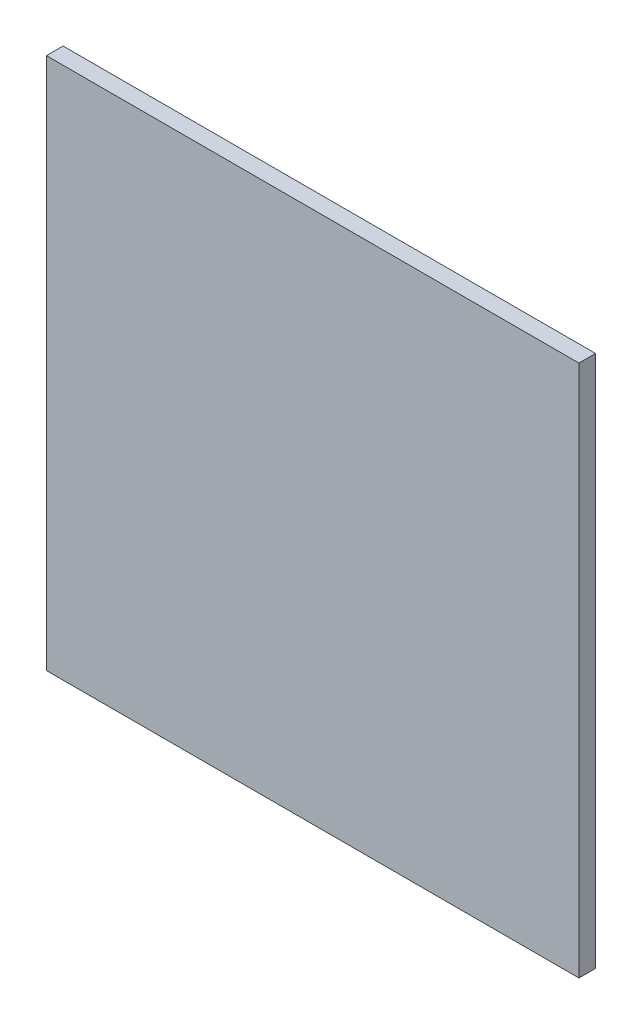
ISO-10303-21;
HEADER;
FILE_DESCRIPTION(('STEP AP214'),'2;1');
FILE_NAME('part.step','',(''),(''),'','','');
FILE_SCHEMA(('AUTOMOTIVE_DESIGN { 1 0 10303 214 1 1 1 1 }'));
ENDSEC;
DATA;
#1=APPLICATION_CONTEXT('core data for automotive mechanical design processes');
#2=APPLICATION_PROTOCOL_DEFINITION('international standard','automotive_design',2000,#1);
#3=PRODUCT_CONTEXT('',#1,'mechanical');
#4=PRODUCT('Part','Part','',(#3));
#5=PRODUCT_RELATED_PRODUCT_CATEGORY('part','',(#4));
#6=PRODUCT_DEFINITION_FORMATION('','',#4);
#7=PRODUCT_DEFINITION_CONTEXT('part definition',#1,'design');
#8=PRODUCT_DEFINITION('design','',#6,#7);
#9=PRODUCT_DEFINITION_SHAPE('','',#8);
#10=(LENGTH_UNIT() NAMED_UNIT(*) SI_UNIT(.MILLI.,.METRE.));
#11=(NAMED_UNIT(*) PLANE_ANGLE_UNIT() SI_UNIT($,.RADIAN.));
#12=(NAMED_UNIT(*) SI_UNIT($,.STERADIAN.) SOLID_ANGLE_UNIT());
#13=UNCERTAINTY_MEASURE_WITH_UNIT(LENGTH_MEASURE(1.E-05),#10,'distance_accuracy_value','');
#14=(GEOMETRIC_REPRESENTATION_CONTEXT(3) GLOBAL_UNCERTAINTY_ASSIGNED_CONTEXT((#13)) GLOBAL_UNIT_ASSIGNED_CONTEXT((#10,
#11,#12)) REPRESENTATION_CONTEXT('',''));
#15=CARTESIAN_POINT('',(0.,0.,0.));
#16=DIRECTION('',(0.,0.,1.));
#17=DIRECTION('',(1.,0.,0.));
#18=AXIS2_PLACEMENT_3D('',#15,#16,#17);
#19=CARTESIAN_POINT('',(0.,0.,19.05));
#20=DIRECTION('',(0.,1.,0.));
#21=DIRECTION('',(0.,0.,1.));
#22=AXIS2_PLACEMENT_3D('',#19,#20,#21);
#23=PLANE('',#22);
#24=DIRECTION('',(1.,0.,0.));
#25=VECTOR('',#24,1.);
#26=CARTESIAN_POINT('',(0.,0.,0.));
#27=LINE('',#26,#25);
#28=CARTESIAN_POINT('',(0.,0.,0.));
#29=VERTEX_POINT('',#28);
#30=CARTESIAN_POINT('',(609.6,0.,0.));
#31=VERTEX_POINT('',#30);
#32=EDGE_CURVE('E100',#29,#31,#27,.T.);
#33=ORIENTED_EDGE('',*,*,#32,.T.);
#34=DIRECTION('',(0.,0.,-1.));
#35=VECTOR('',#34,1.);
#36=CARTESIAN_POINT('',(609.6,0.,19.05));
#37=LINE('',#36,#35);
#38=CARTESIAN_POINT('',(609.6,0.,19.05));
#39=VERTEX_POINT('',#38);
#40=EDGE_CURVE('E11',#39,#31,#37,.T.);
#41=ORIENTED_EDGE('',*,*,#40,.F.);
#42=DIRECTION('',(1.,0.,0.));
#43=VECTOR('',#42,1.);
#44=CARTESIAN_POINT('',(0.,0.,19.05));
#45=LINE('',#44,#43);
#46=CARTESIAN_POINT('',(0.,0.,19.05));
#47=VERTEX_POINT('',#46);
#48=EDGE_CURVE('E86',#47,#39,#45,.T.);
#49=ORIENTED_EDGE('',*,*,#48,.F.);
#50=DIRECTION('',(0.,0.,-1.));
#51=VECTOR('',#50,1.);
#52=CARTESIAN_POINT('',(0.,0.,19.05));
#53=LINE('',#52,#51);
#54=EDGE_CURVE('E53',#47,#29,#53,.T.);
#55=ORIENTED_EDGE('',*,*,#54,.T.);
#56=EDGE_LOOP('',(#33,#41,#49,#55));
#57=FACE_BOUND('',#56,.T.);
#58=ADVANCED_FACE('F37',(#57),#23,.F.);
#59=CARTESIAN_POINT('',(609.6,0.,19.05));
#60=DIRECTION('',(-1.,0.,0.));
#61=DIRECTION('',(0.,0.,1.));
#62=AXIS2_PLACEMENT_3D('',#59,#60,#61);
#63=PLANE('',#62);
#64=DIRECTION('',(0.,1.,0.));
#65=VECTOR('',#64,1.);
#66=CARTESIAN_POINT('',(609.6,0.,0.));
#67=LINE('',#66,#65);
#68=CARTESIAN_POINT('',(609.6,609.6,0.));
#69=VERTEX_POINT('',#68);
#70=EDGE_CURVE('E91',#31,#69,#67,.T.);
#71=ORIENTED_EDGE('',*,*,#70,.T.);
#72=DIRECTION('',(0.,0.,-1.));
#73=VECTOR('',#72,1.);
#74=CARTESIAN_POINT('',(609.6,609.6,19.05));
#75=LINE('',#74,#73);
#76=CARTESIAN_POINT('',(609.6,609.6,19.05));
#77=VERTEX_POINT('',#76);
#78=EDGE_CURVE('E45',#77,#69,#75,.T.);
#79=ORIENTED_EDGE('',*,*,#78,.F.);
#80=DIRECTION('',(0.,1.,0.));
#81=VECTOR('',#80,1.);
#82=CARTESIAN_POINT('',(609.6,0.,19.05));
#83=LINE('',#82,#81);
#84=EDGE_CURVE('E78',#39,#77,#83,.T.);
#85=ORIENTED_EDGE('',*,*,#84,.F.);
#86=ORIENTED_EDGE('',*,*,#40,.T.);
#87=EDGE_LOOP('',(#71,#79,#85,#86));
#88=FACE_BOUND('',#87,.T.);
#89=ADVANCED_FACE('F90',(#88),#63,.F.);
#90=CARTESIAN_POINT('',(0.,609.6,19.05));
#91=DIRECTION('',(0.,1.,0.));
#92=DIRECTION('',(0.,0.,1.));
#93=AXIS2_PLACEMENT_3D('',#90,#91,#92);
#94=PLANE('',#93);
#95=DIRECTION('',(1.,0.,0.));
#96=VECTOR('',#95,1.);
#97=CARTESIAN_POINT('',(0.,609.6,0.));
#98=LINE('',#97,#96);
#99=CARTESIAN_POINT('',(0.,609.6,0.));
#100=VERTEX_POINT('',#99);
#101=EDGE_CURVE('E103',#100,#69,#98,.T.);
#102=ORIENTED_EDGE('',*,*,#101,.F.);
#103=DIRECTION('',(0.,0.,-1.));
#104=VECTOR('',#103,1.);
#105=CARTESIAN_POINT('',(0.,609.6,19.05));
#106=LINE('',#105,#104);
#107=CARTESIAN_POINT('',(0.,609.6,19.05));
#108=VERTEX_POINT('',#107);
#109=EDGE_CURVE('E67',#108,#100,#106,.T.);
#110=ORIENTED_EDGE('',*,*,#109,.F.);
#111=DIRECTION('',(1.,0.,0.));
#112=VECTOR('',#111,1.);
#113=CARTESIAN_POINT('',(0.,609.6,19.05));
#114=LINE('',#113,#112);
#115=EDGE_CURVE('E85',#108,#77,#114,.T.);
#116=ORIENTED_EDGE('',*,*,#115,.T.);
#117=ORIENTED_EDGE('',*,*,#78,.T.);
#118=EDGE_LOOP('',(#102,#110,#116,#117));
#119=FACE_BOUND('',#118,.T.);
#120=ADVANCED_FACE('F94',(#119),#94,.T.);
#121=CARTESIAN_POINT('',(0.,0.,19.05));
#122=DIRECTION('',(-1.,0.,0.));
#123=DIRECTION('',(0.,0.,1.));
#124=AXIS2_PLACEMENT_3D('',#121,#122,#123);
#125=PLANE('',#124);
#126=DIRECTION('',(0.,1.,0.));
#127=VECTOR('',#126,1.);
#128=CARTESIAN_POINT('',(0.,0.,0.));
#129=LINE('',#128,#127);
#130=EDGE_CURVE('E105',#29,#100,#129,.T.);
#131=ORIENTED_EDGE('',*,*,#130,.F.);
#132=ORIENTED_EDGE('',*,*,#54,.F.);
#133=DIRECTION('',(0.,1.,0.));
#134=VECTOR('',#133,1.);
#135=CARTESIAN_POINT('',(0.,0.,19.05));
#136=LINE('',#135,#134);
#137=EDGE_CURVE('E95',#47,#108,#136,.T.);
#138=ORIENTED_EDGE('',*,*,#137,.T.);
#139=ORIENTED_EDGE('',*,*,#109,.T.);
#140=EDGE_LOOP('',(#131,#132,#138,#139));
#141=FACE_BOUND('',#140,.T.);
#142=ADVANCED_FACE('F111',(#141),#125,.T.);
#143=CARTESIAN_POINT('',(0.,0.,19.05));
#144=DIRECTION('',(0.,0.,1.));
#145=DIRECTION('',(1.,0.,0.));
#146=AXIS2_PLACEMENT_3D('',#143,#144,#145);
#147=PLANE('',#146);
#148=ORIENTED_EDGE('',*,*,#48,.T.);
#149=ORIENTED_EDGE('',*,*,#84,.T.);
#150=ORIENTED_EDGE('',*,*,#115,.F.);
#151=ORIENTED_EDGE('',*,*,#137,.F.);
#152=EDGE_LOOP('',(#148,#149,#150,#151));
#153=FACE_BOUND('',#152,.T.);
#154=ADVANCED_FACE('F82',(#153),#147,.T.);
#155=CARTESIAN_POINT('',(0.,0.,0.));
#156=DIRECTION('',(0.,0.,1.));
#157=DIRECTION('',(1.,0.,0.));
#158=AXIS2_PLACEMENT_3D('',#155,#156,#157);
#159=PLANE('',#158);
#160=ORIENTED_EDGE('',*,*,#32,.F.);
#161=ORIENTED_EDGE('',*,*,#130,.T.);
#162=ORIENTED_EDGE('',*,*,#101,.T.);
#163=ORIENTED_EDGE('',*,*,#70,.F.);
#164=EDGE_LOOP('',(#160,#161,#162,#163));
#165=FACE_BOUND('',#164,.T.);
#166=ADVANCED_FACE('F110',(#165),#159,.F.);
#167=CLOSED_SHELL('',(#58,#89,#120,#142,#154,#166));
#168=MANIFOLD_SOLID_BREP('B2',#167);
#169=ADVANCED_BREP_SHAPE_REPRESENTATION('',(#18,#168),#14);
#170=SHAPE_DEFINITION_REPRESENTATION(#9,#169);
ENDSEC;
END-ISO-10303-21;
